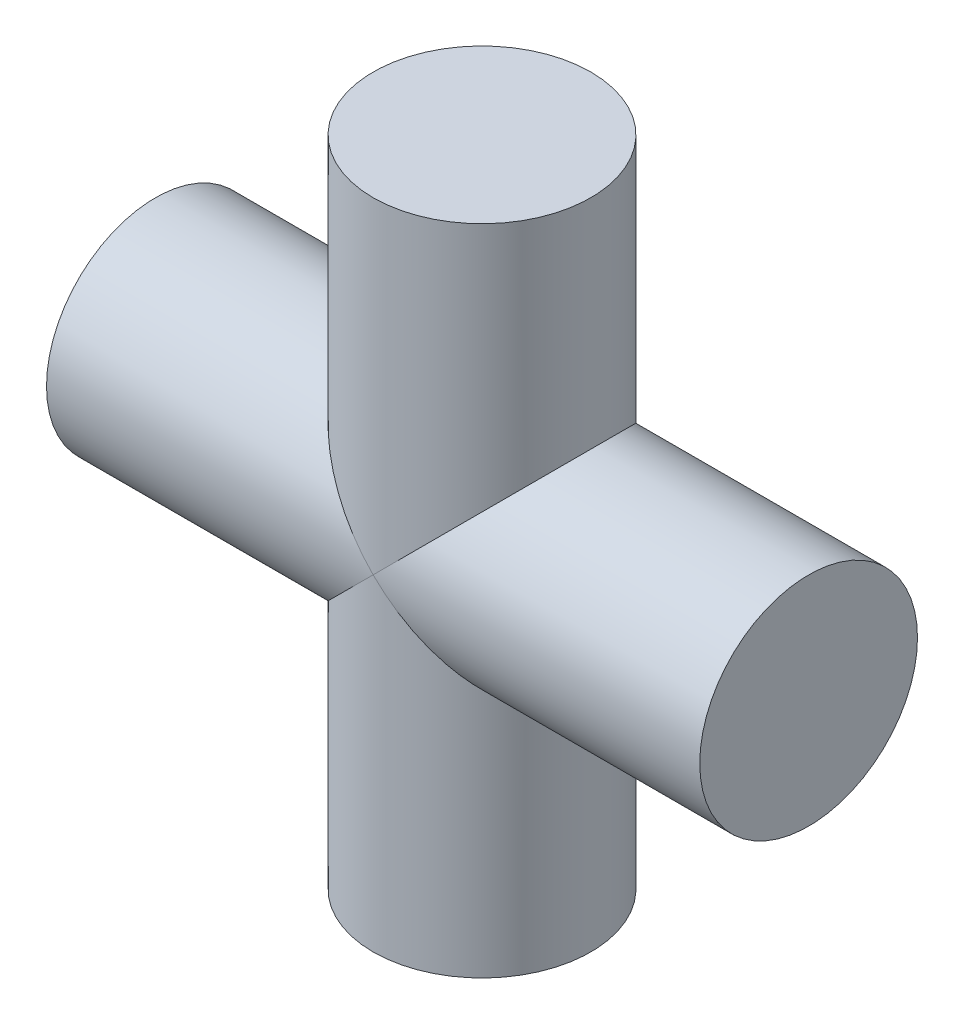
ISO-10303-21;
HEADER;
FILE_DESCRIPTION(('STEP AP214'),'2;1');
FILE_NAME('part.step','',(''),(''),'','','');
FILE_SCHEMA(('AUTOMOTIVE_DESIGN { 1 0 10303 214 1 1 1 1 }'));
ENDSEC;
DATA;
#1=APPLICATION_CONTEXT('core data for automotive mechanical design processes');
#2=APPLICATION_PROTOCOL_DEFINITION('international standard','automotive_design',2000,#1);
#3=PRODUCT_CONTEXT('',#1,'mechanical');
#4=PRODUCT('Part','Part','',(#3));
#5=PRODUCT_RELATED_PRODUCT_CATEGORY('part','',(#4));
#6=PRODUCT_DEFINITION_FORMATION('','',#4);
#7=PRODUCT_DEFINITION_CONTEXT('part definition',#1,'design');
#8=PRODUCT_DEFINITION('design','',#6,#7);
#9=PRODUCT_DEFINITION_SHAPE('','',#8);
#10=(LENGTH_UNIT() NAMED_UNIT(*) SI_UNIT(.MILLI.,.METRE.));
#11=(NAMED_UNIT(*) PLANE_ANGLE_UNIT() SI_UNIT($,.RADIAN.));
#12=(NAMED_UNIT(*) SI_UNIT($,.STERADIAN.) SOLID_ANGLE_UNIT());
#13=UNCERTAINTY_MEASURE_WITH_UNIT(LENGTH_MEASURE(1.E-05),#10,'distance_accuracy_value','');
#14=(GEOMETRIC_REPRESENTATION_CONTEXT(3) GLOBAL_UNCERTAINTY_ASSIGNED_CONTEXT((#13)) GLOBAL_UNIT_ASSIGNED_CONTEXT((#10,
#11,#12)) REPRESENTATION_CONTEXT('',''));
#15=CARTESIAN_POINT('',(0.,0.,0.));
#16=DIRECTION('',(0.,0.,1.));
#17=DIRECTION('',(1.,0.,0.));
#18=AXIS2_PLACEMENT_3D('',#15,#16,#17);
#19=CARTESIAN_POINT('',(0.,150.,0.));
#20=DIRECTION('',(0.,-1.,0.));
#21=DIRECTION('',(0.,0.,-1.));
#22=AXIS2_PLACEMENT_3D('',#19,#20,#21);
#23=CYLINDRICAL_SURFACE('',#22,50.);
#24=CARTESIAN_POINT('',(0.,150.,0.));
#25=DIRECTION('',(0.,1.,0.));
#26=DIRECTION('',(0.,0.,1.));
#27=AXIS2_PLACEMENT_3D('',#24,#25,#26);
#28=CIRCLE('',#27,50.);
#29=CARTESIAN_POINT('',(0.,150.,50.));
#30=VERTEX_POINT('',#29);
#31=EDGE_CURVE('E65',#30,#30,#28,.T.);
#32=ORIENTED_EDGE('',*,*,#31,.F.);
#33=EDGE_LOOP('',(#32));
#34=FACE_BOUND('',#33,.T.);
#35=CARTESIAN_POINT('',(0.,0.,0.));
#36=DIRECTION('',(-0.707106781186547,-0.707106781186547,0.));
#37=DIRECTION('',(0.707106781186547,-0.707106781186547,0.));
#38=AXIS2_PLACEMENT_3D('',#35,#36,#37);
#39=ELLIPSE('',#38,70.7106781186548,50.);
#40=CARTESIAN_POINT('',(0.,0.,50.));
#41=VERTEX_POINT('',#40);
#42=CARTESIAN_POINT('',(0.,0.,-50.));
#43=VERTEX_POINT('',#42);
#44=EDGE_CURVE('E49',#41,#43,#39,.T.);
#45=ORIENTED_EDGE('',*,*,#44,.F.);
#46=CARTESIAN_POINT('',(0.,0.,0.));
#47=DIRECTION('',(0.707106781186547,-0.707106781186547,0.));
#48=DIRECTION('',(-0.707106781186547,-0.707106781186547,0.));
#49=AXIS2_PLACEMENT_3D('',#46,#47,#48);
#50=ELLIPSE('',#49,70.7106781186548,50.);
#51=EDGE_CURVE('E61',#43,#41,#50,.T.);
#52=ORIENTED_EDGE('',*,*,#51,.F.);
#53=EDGE_LOOP('',(#45,#52));
#54=FACE_BOUND('',#53,.T.);
#55=ADVANCED_FACE('F41',(#34,#54),#23,.T.);
#56=CARTESIAN_POINT('',(0.,150.,0.));
#57=DIRECTION('',(0.,1.,0.));
#58=DIRECTION('',(0.,0.,1.));
#59=AXIS2_PLACEMENT_3D('',#56,#57,#58);
#60=PLANE('',#59);
#61=ORIENTED_EDGE('',*,*,#31,.T.);
#62=EDGE_LOOP('',(#61));
#63=FACE_BOUND('',#62,.T.);
#64=ADVANCED_FACE('F88',(#63),#60,.T.);
#65=CARTESIAN_POINT('',(-150.,0.,0.));
#66=DIRECTION('',(1.,0.,0.));
#67=DIRECTION('',(0.,0.,-1.));
#68=AXIS2_PLACEMENT_3D('',#65,#66,#67);
#69=PLANE('',#68);
#70=CARTESIAN_POINT('',(-150.,0.,0.));
#71=DIRECTION('',(1.,0.,0.));
#72=DIRECTION('',(0.,0.,-1.));
#73=AXIS2_PLACEMENT_3D('',#70,#71,#72);
#74=CIRCLE('',#73,50.);
#75=CARTESIAN_POINT('',(-150.,0.,-50.));
#76=VERTEX_POINT('',#75);
#77=EDGE_CURVE('E102',#76,#76,#74,.T.);
#78=ORIENTED_EDGE('',*,*,#77,.F.);
#79=EDGE_LOOP('',(#78));
#80=FACE_BOUND('',#79,.T.);
#81=ADVANCED_FACE('F85',(#80),#69,.F.);
#82=CARTESIAN_POINT('',(150.,0.,0.));
#83=DIRECTION('',(-1.,0.,0.));
#84=DIRECTION('',(0.,0.,1.));
#85=AXIS2_PLACEMENT_3D('',#82,#83,#84);
#86=CYLINDRICAL_SURFACE('',#85,50.);
#87=ORIENTED_EDGE('',*,*,#77,.T.);
#88=EDGE_LOOP('',(#87));
#89=FACE_BOUND('',#88,.T.);
#90=CARTESIAN_POINT('',(0.,0.,0.));
#91=DIRECTION('',(0.707106781186547,-0.707106781186547,0.));
#92=DIRECTION('',(-0.707106781186547,-0.707106781186547,0.));
#93=AXIS2_PLACEMENT_3D('',#90,#91,#92);
#94=ELLIPSE('',#93,70.7106781186548,50.);
#95=EDGE_CURVE('E55',#43,#41,#94,.F.);
#96=ORIENTED_EDGE('',*,*,#95,.T.);
#97=ORIENTED_EDGE('',*,*,#44,.T.);
#98=EDGE_LOOP('',(#96,#97));
#99=FACE_BOUND('',#98,.T.);
#100=ADVANCED_FACE('F67',(#89,#99),#86,.T.);
#101=CARTESIAN_POINT('',(0.,-150.,0.));
#102=DIRECTION('',(0.,1.,0.));
#103=DIRECTION('',(0.,0.,1.));
#104=AXIS2_PLACEMENT_3D('',#101,#102,#103);
#105=PLANE('',#104);
#106=CARTESIAN_POINT('',(0.,-150.,0.));
#107=DIRECTION('',(0.,1.,0.));
#108=DIRECTION('',(0.,0.,1.));
#109=AXIS2_PLACEMENT_3D('',#106,#107,#108);
#110=CIRCLE('',#109,50.);
#111=CARTESIAN_POINT('',(0.,-150.,50.));
#112=VERTEX_POINT('',#111);
#113=EDGE_CURVE('E96',#112,#112,#110,.T.);
#114=ORIENTED_EDGE('',*,*,#113,.F.);
#115=EDGE_LOOP('',(#114));
#116=FACE_BOUND('',#115,.T.);
#117=ADVANCED_FACE('F79',(#116),#105,.F.);
#118=ORIENTED_EDGE('',*,*,#113,.T.);
#119=EDGE_LOOP('',(#118));
#120=FACE_BOUND('',#119,.T.);
#121=CARTESIAN_POINT('',(0.,0.,0.));
#122=DIRECTION('',(-0.707106781186547,-0.707106781186547,0.));
#123=DIRECTION('',(0.707106781186547,-0.707106781186547,0.));
#124=AXIS2_PLACEMENT_3D('',#121,#122,#123);
#125=ELLIPSE('',#124,70.7106781186548,50.);
#126=EDGE_CURVE('E11',#41,#43,#125,.F.);
#127=ORIENTED_EDGE('',*,*,#126,.F.);
#128=ORIENTED_EDGE('',*,*,#95,.F.);
#129=EDGE_LOOP('',(#127,#128));
#130=FACE_BOUND('',#129,.T.);
#131=ADVANCED_FACE('F43',(#120,#130),#23,.T.);
#132=CARTESIAN_POINT('',(150.,0.,0.));
#133=DIRECTION('',(1.,0.,0.));
#134=DIRECTION('',(0.,0.,-1.));
#135=AXIS2_PLACEMENT_3D('',#132,#133,#134);
#136=CIRCLE('',#135,50.);
#137=CARTESIAN_POINT('',(150.,0.,-50.));
#138=VERTEX_POINT('',#137);
#139=EDGE_CURVE('E99',#138,#138,#136,.T.);
#140=ORIENTED_EDGE('',*,*,#139,.F.);
#141=EDGE_LOOP('',(#140));
#142=FACE_BOUND('',#141,.T.);
#143=ORIENTED_EDGE('',*,*,#51,.T.);
#144=ORIENTED_EDGE('',*,*,#126,.T.);
#145=EDGE_LOOP('',(#143,#144));
#146=FACE_BOUND('',#145,.T.);
#147=ADVANCED_FACE('F68',(#142,#146),#86,.T.);
#148=CARTESIAN_POINT('',(150.,0.,0.));
#149=DIRECTION('',(1.,0.,0.));
#150=DIRECTION('',(0.,0.,-1.));
#151=AXIS2_PLACEMENT_3D('',#148,#149,#150);
#152=PLANE('',#151);
#153=ORIENTED_EDGE('',*,*,#139,.T.);
#154=EDGE_LOOP('',(#153));
#155=FACE_BOUND('',#154,.T.);
#156=ADVANCED_FACE('F70',(#155),#152,.T.);
#157=CLOSED_SHELL('',(#55,#64,#81,#100,#117,#131,#147,#156));
#158=MANIFOLD_SOLID_BREP('B2',#157);
#159=ADVANCED_BREP_SHAPE_REPRESENTATION('',(#18,#158),#14);
#160=SHAPE_DEFINITION_REPRESENTATION(#9,#159);
ENDSEC;
END-ISO-10303-21;
